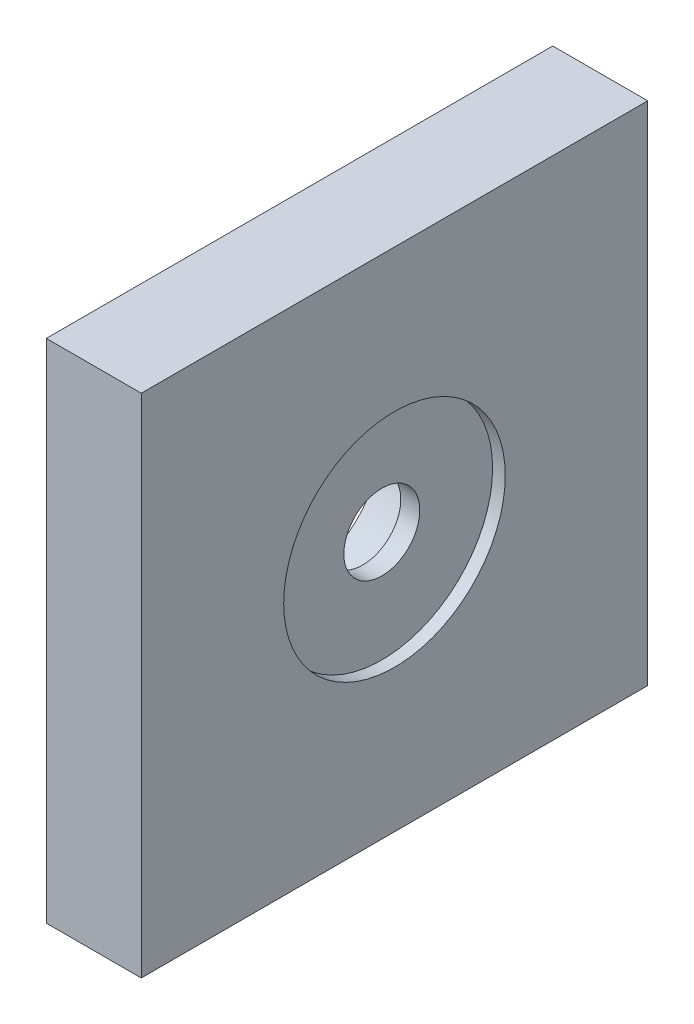
ISO-10303-21;
HEADER;
FILE_DESCRIPTION(('STEP AP214'),'2;1');
FILE_NAME('part.step','',(''),(''),'','','');
FILE_SCHEMA(('AUTOMOTIVE_DESIGN { 1 0 10303 214 1 1 1 1 }'));
ENDSEC;
DATA;
#1=APPLICATION_CONTEXT('core data for automotive mechanical design processes');
#2=APPLICATION_PROTOCOL_DEFINITION('international standard','automotive_design',2000,#1);
#3=PRODUCT_CONTEXT('',#1,'mechanical');
#4=PRODUCT('Part','Part','',(#3));
#5=PRODUCT_RELATED_PRODUCT_CATEGORY('part','',(#4));
#6=PRODUCT_DEFINITION_FORMATION('','',#4);
#7=PRODUCT_DEFINITION_CONTEXT('part definition',#1,'design');
#8=PRODUCT_DEFINITION('design','',#6,#7);
#9=PRODUCT_DEFINITION_SHAPE('','',#8);
#10=(LENGTH_UNIT() NAMED_UNIT(*) SI_UNIT(.MILLI.,.METRE.));
#11=(NAMED_UNIT(*) PLANE_ANGLE_UNIT() SI_UNIT($,.RADIAN.));
#12=(NAMED_UNIT(*) SI_UNIT($,.STERADIAN.) SOLID_ANGLE_UNIT());
#13=UNCERTAINTY_MEASURE_WITH_UNIT(LENGTH_MEASURE(1.E-05),#10,'distance_accuracy_value','');
#14=(GEOMETRIC_REPRESENTATION_CONTEXT(3) GLOBAL_UNCERTAINTY_ASSIGNED_CONTEXT((#13)) GLOBAL_UNIT_ASSIGNED_CONTEXT((#10,
#11,#12)) REPRESENTATION_CONTEXT('',''));
#15=CARTESIAN_POINT('',(0.,0.,0.));
#16=DIRECTION('',(0.,0.,1.));
#17=DIRECTION('',(1.,0.,0.));
#18=AXIS2_PLACEMENT_3D('',#15,#16,#17);
#19=CARTESIAN_POINT('',(15.,80.,0.));
#20=DIRECTION('',(0.,0.,-1.));
#21=DIRECTION('',(-1.,0.,0.));
#22=AXIS2_PLACEMENT_3D('',#19,#20,#21);
#23=PLANE('',#22);
#24=DIRECTION('',(0.,-1.,0.));
#25=VECTOR('',#24,1.);
#26=CARTESIAN_POINT('',(0.,80.,0.));
#27=LINE('',#26,#25);
#28=CARTESIAN_POINT('',(0.,80.,0.));
#29=VERTEX_POINT('',#28);
#30=CARTESIAN_POINT('',(0.,0.,0.));
#31=VERTEX_POINT('',#30);
#32=EDGE_CURVE('E116',#29,#31,#27,.T.);
#33=ORIENTED_EDGE('',*,*,#32,.F.);
#34=DIRECTION('',(-1.,0.,0.));
#35=VECTOR('',#34,1.);
#36=CARTESIAN_POINT('',(15.,80.,0.));
#37=LINE('',#36,#35);
#38=CARTESIAN_POINT('',(15.,80.,0.));
#39=VERTEX_POINT('',#38);
#40=EDGE_CURVE('E11',#39,#29,#37,.T.);
#41=ORIENTED_EDGE('',*,*,#40,.F.);
#42=DIRECTION('',(0.,-1.,0.));
#43=VECTOR('',#42,1.);
#44=CARTESIAN_POINT('',(15.,80.,0.));
#45=LINE('',#44,#43);
#46=CARTESIAN_POINT('',(15.,0.,0.));
#47=VERTEX_POINT('',#46);
#48=EDGE_CURVE('E107',#39,#47,#45,.T.);
#49=ORIENTED_EDGE('',*,*,#48,.T.);
#50=DIRECTION('',(-1.,0.,0.));
#51=VECTOR('',#50,1.);
#52=CARTESIAN_POINT('',(15.,0.,0.));
#53=LINE('',#52,#51);
#54=EDGE_CURVE('E48',#47,#31,#53,.T.);
#55=ORIENTED_EDGE('',*,*,#54,.T.);
#56=EDGE_LOOP('',(#33,#41,#49,#55));
#57=FACE_BOUND('',#56,.T.);
#58=ADVANCED_FACE('F45',(#57),#23,.T.);
#59=CARTESIAN_POINT('',(15.,80.,80.));
#60=DIRECTION('',(0.,1.,0.));
#61=DIRECTION('',(0.,0.,1.));
#62=AXIS2_PLACEMENT_3D('',#59,#60,#61);
#63=PLANE('',#62);
#64=DIRECTION('',(0.,0.,-1.));
#65=VECTOR('',#64,1.);
#66=CARTESIAN_POINT('',(0.,80.,80.));
#67=LINE('',#66,#65);
#68=CARTESIAN_POINT('',(0.,80.,80.));
#69=VERTEX_POINT('',#68);
#70=EDGE_CURVE('E110',#69,#29,#67,.T.);
#71=ORIENTED_EDGE('',*,*,#70,.F.);
#72=DIRECTION('',(-1.,0.,0.));
#73=VECTOR('',#72,1.);
#74=CARTESIAN_POINT('',(15.,80.,80.));
#75=LINE('',#74,#73);
#76=CARTESIAN_POINT('',(15.,80.,80.));
#77=VERTEX_POINT('',#76);
#78=EDGE_CURVE('E55',#77,#69,#75,.T.);
#79=ORIENTED_EDGE('',*,*,#78,.F.);
#80=DIRECTION('',(0.,0.,-1.));
#81=VECTOR('',#80,1.);
#82=CARTESIAN_POINT('',(15.,80.,80.));
#83=LINE('',#82,#81);
#84=EDGE_CURVE('E102',#77,#39,#83,.T.);
#85=ORIENTED_EDGE('',*,*,#84,.T.);
#86=ORIENTED_EDGE('',*,*,#40,.T.);
#87=EDGE_LOOP('',(#71,#79,#85,#86));
#88=FACE_BOUND('',#87,.T.);
#89=ADVANCED_FACE('F133',(#88),#63,.T.);
#90=CARTESIAN_POINT('',(15.,0.,80.));
#91=DIRECTION('',(0.,0.,1.));
#92=DIRECTION('',(0.,-1.,0.));
#93=AXIS2_PLACEMENT_3D('',#90,#91,#92);
#94=PLANE('',#93);
#95=DIRECTION('',(0.,1.,0.));
#96=VECTOR('',#95,1.);
#97=CARTESIAN_POINT('',(0.,0.,80.));
#98=LINE('',#97,#96);
#99=CARTESIAN_POINT('',(0.,0.,80.));
#100=VERTEX_POINT('',#99);
#101=EDGE_CURVE('E96',#100,#69,#98,.T.);
#102=ORIENTED_EDGE('',*,*,#101,.F.);
#103=DIRECTION('',(-1.,0.,0.));
#104=VECTOR('',#103,1.);
#105=CARTESIAN_POINT('',(15.,0.,80.));
#106=LINE('',#105,#104);
#107=CARTESIAN_POINT('',(15.,0.,80.));
#108=VERTEX_POINT('',#107);
#109=EDGE_CURVE('E91',#108,#100,#106,.T.);
#110=ORIENTED_EDGE('',*,*,#109,.F.);
#111=DIRECTION('',(0.,1.,0.));
#112=VECTOR('',#111,1.);
#113=CARTESIAN_POINT('',(15.,0.,80.));
#114=LINE('',#113,#112);
#115=EDGE_CURVE('E94',#108,#77,#114,.T.);
#116=ORIENTED_EDGE('',*,*,#115,.T.);
#117=ORIENTED_EDGE('',*,*,#78,.T.);
#118=EDGE_LOOP('',(#102,#110,#116,#117));
#119=FACE_BOUND('',#118,.T.);
#120=ADVANCED_FACE('F93',(#119),#94,.T.);
#121=CARTESIAN_POINT('',(15.,0.,0.));
#122=DIRECTION('',(0.,-1.,0.));
#123=DIRECTION('',(0.,0.,-1.));
#124=AXIS2_PLACEMENT_3D('',#121,#122,#123);
#125=PLANE('',#124);
#126=DIRECTION('',(0.,0.,1.));
#127=VECTOR('',#126,1.);
#128=CARTESIAN_POINT('',(0.,0.,0.));
#129=LINE('',#128,#127);
#130=EDGE_CURVE('E120',#31,#100,#129,.T.);
#131=ORIENTED_EDGE('',*,*,#130,.F.);
#132=ORIENTED_EDGE('',*,*,#54,.F.);
#133=DIRECTION('',(0.,0.,1.));
#134=VECTOR('',#133,1.);
#135=CARTESIAN_POINT('',(15.,0.,0.));
#136=LINE('',#135,#134);
#137=EDGE_CURVE('E101',#47,#108,#136,.T.);
#138=ORIENTED_EDGE('',*,*,#137,.T.);
#139=ORIENTED_EDGE('',*,*,#109,.T.);
#140=EDGE_LOOP('',(#131,#132,#138,#139));
#141=FACE_BOUND('',#140,.T.);
#142=ADVANCED_FACE('F105',(#141),#125,.T.);
#143=CARTESIAN_POINT('',(15.,0.,0.));
#144=DIRECTION('',(-1.,0.,0.));
#145=DIRECTION('',(0.,0.,1.));
#146=AXIS2_PLACEMENT_3D('',#143,#144,#145);
#147=PLANE('',#146);
#148=CARTESIAN_POINT('',(15.,40.,40.));
#149=DIRECTION('',(-1.,0.,0.));
#150=DIRECTION('',(0.,0.,1.));
#151=AXIS2_PLACEMENT_3D('',#148,#149,#150);
#152=CIRCLE('',#151,17.5);
#153=CARTESIAN_POINT('',(15.,40.,57.5));
#154=VERTEX_POINT('',#153);
#155=EDGE_CURVE('E121',#154,#154,#152,.T.);
#156=ORIENTED_EDGE('',*,*,#155,.T.);
#157=EDGE_LOOP('',(#156));
#158=FACE_BOUND('',#157,.T.);
#159=ORIENTED_EDGE('',*,*,#48,.F.);
#160=ORIENTED_EDGE('',*,*,#84,.F.);
#161=ORIENTED_EDGE('',*,*,#115,.F.);
#162=ORIENTED_EDGE('',*,*,#137,.F.);
#163=EDGE_LOOP('',(#159,#160,#161,#162));
#164=FACE_BOUND('',#163,.T.);
#165=ADVANCED_FACE('F100',(#158,#164),#147,.F.);
#166=CARTESIAN_POINT('',(0.,0.,0.));
#167=DIRECTION('',(-1.,0.,0.));
#168=DIRECTION('',(0.,0.,1.));
#169=AXIS2_PLACEMENT_3D('',#166,#167,#168);
#170=PLANE('',#169);
#171=CARTESIAN_POINT('',(0.,40.,40.));
#172=DIRECTION('',(-1.,0.,0.));
#173=DIRECTION('',(0.,0.,1.));
#174=AXIS2_PLACEMENT_3D('',#171,#172,#173);
#175=CIRCLE('',#174,13.);
#176=CARTESIAN_POINT('',(0.,40.,53.));
#177=VERTEX_POINT('',#176);
#178=EDGE_CURVE('E195',#177,#177,#175,.T.);
#179=ORIENTED_EDGE('',*,*,#178,.F.);
#180=EDGE_LOOP('',(#179));
#181=FACE_BOUND('',#180,.T.);
#182=ORIENTED_EDGE('',*,*,#32,.T.);
#183=ORIENTED_EDGE('',*,*,#130,.T.);
#184=ORIENTED_EDGE('',*,*,#101,.T.);
#185=ORIENTED_EDGE('',*,*,#70,.T.);
#186=EDGE_LOOP('',(#182,#183,#184,#185));
#187=FACE_BOUND('',#186,.T.);
#188=ADVANCED_FACE('F132',(#181,#187),#170,.T.);
#189=CARTESIAN_POINT('',(15.,40.,40.));
#190=DIRECTION('',(-1.,0.,0.));
#191=DIRECTION('',(0.,0.,1.));
#192=AXIS2_PLACEMENT_3D('',#189,#190,#191);
#193=CYLINDRICAL_SURFACE('',#192,17.5);
#194=ORIENTED_EDGE('',*,*,#155,.F.);
#195=EDGE_LOOP('',(#194));
#196=FACE_BOUND('',#195,.T.);
#197=CARTESIAN_POINT('',(13.,40.,40.));
#198=DIRECTION('',(-1.,0.,0.));
#199=DIRECTION('',(0.,0.,1.));
#200=AXIS2_PLACEMENT_3D('',#197,#198,#199);
#201=CIRCLE('',#200,17.5);
#202=CARTESIAN_POINT('',(13.,40.,57.5));
#203=VERTEX_POINT('',#202);
#204=EDGE_CURVE('E178',#203,#203,#201,.T.);
#205=ORIENTED_EDGE('',*,*,#204,.T.);
#206=EDGE_LOOP('',(#205));
#207=FACE_BOUND('',#206,.T.);
#208=ADVANCED_FACE('F151',(#196,#207),#193,.F.);
#209=CARTESIAN_POINT('',(15.,40.,40.));
#210=DIRECTION('',(-1.,0.,0.));
#211=DIRECTION('',(0.,0.,1.));
#212=AXIS2_PLACEMENT_3D('',#209,#210,#211);
#213=CYLINDRICAL_SURFACE('',#212,13.);
#214=CARTESIAN_POINT('',(10.,40.,40.));
#215=DIRECTION('',(-1.,0.,0.));
#216=DIRECTION('',(0.,0.,1.));
#217=AXIS2_PLACEMENT_3D('',#214,#215,#216);
#218=CIRCLE('',#217,13.);
#219=CARTESIAN_POINT('',(10.,40.,53.));
#220=VERTEX_POINT('',#219);
#221=EDGE_CURVE('E188',#220,#220,#218,.T.);
#222=ORIENTED_EDGE('',*,*,#221,.F.);
#223=EDGE_LOOP('',(#222));
#224=FACE_BOUND('',#223,.T.);
#225=ORIENTED_EDGE('',*,*,#178,.T.);
#226=EDGE_LOOP('',(#225));
#227=FACE_BOUND('',#226,.T.);
#228=ADVANCED_FACE('F157',(#224,#227),#213,.F.);
#229=CARTESIAN_POINT('',(10.,53.,40.));
#230=DIRECTION('',(1.,0.,0.));
#231=DIRECTION('',(0.,0.,-1.));
#232=AXIS2_PLACEMENT_3D('',#229,#230,#231);
#233=PLANE('',#232);
#234=CARTESIAN_POINT('',(10.,40.,40.));
#235=DIRECTION('',(-1.,0.,0.));
#236=DIRECTION('',(0.,0.,1.));
#237=AXIS2_PLACEMENT_3D('',#234,#235,#236);
#238=CIRCLE('',#237,6.);
#239=CARTESIAN_POINT('',(10.,40.,46.));
#240=VERTEX_POINT('',#239);
#241=EDGE_CURVE('E183',#240,#240,#238,.T.);
#242=ORIENTED_EDGE('',*,*,#241,.F.);
#243=EDGE_LOOP('',(#242));
#244=FACE_BOUND('',#243,.T.);
#245=ORIENTED_EDGE('',*,*,#221,.T.);
#246=EDGE_LOOP('',(#245));
#247=FACE_BOUND('',#246,.T.);
#248=ADVANCED_FACE('F161',(#244,#247),#233,.F.);
#249=CARTESIAN_POINT('',(15.,40.,40.));
#250=DIRECTION('',(-1.,0.,0.));
#251=DIRECTION('',(0.,0.,1.));
#252=AXIS2_PLACEMENT_3D('',#249,#250,#251);
#253=CYLINDRICAL_SURFACE('',#252,6.);
#254=CARTESIAN_POINT('',(13.,40.,40.));
#255=DIRECTION('',(-1.,0.,0.));
#256=DIRECTION('',(0.,0.,1.));
#257=AXIS2_PLACEMENT_3D('',#254,#255,#256);
#258=CIRCLE('',#257,6.);
#259=CARTESIAN_POINT('',(13.,40.,46.));
#260=VERTEX_POINT('',#259);
#261=EDGE_CURVE('E181',#260,#260,#258,.T.);
#262=ORIENTED_EDGE('',*,*,#261,.F.);
#263=EDGE_LOOP('',(#262));
#264=FACE_BOUND('',#263,.T.);
#265=ORIENTED_EDGE('',*,*,#241,.T.);
#266=EDGE_LOOP('',(#265));
#267=FACE_BOUND('',#266,.T.);
#268=ADVANCED_FACE('F165',(#264,#267),#253,.F.);
#269=CARTESIAN_POINT('',(13.,46.,40.));
#270=DIRECTION('',(-1.,0.,0.));
#271=DIRECTION('',(0.,0.,1.));
#272=AXIS2_PLACEMENT_3D('',#269,#270,#271);
#273=PLANE('',#272);
#274=ORIENTED_EDGE('',*,*,#204,.F.);
#275=EDGE_LOOP('',(#274));
#276=FACE_BOUND('',#275,.T.);
#277=ORIENTED_EDGE('',*,*,#261,.T.);
#278=EDGE_LOOP('',(#277));
#279=FACE_BOUND('',#278,.T.);
#280=ADVANCED_FACE('F169',(#276,#279),#273,.F.);
#281=CLOSED_SHELL('',(#58,#89,#120,#142,#165,#188,#208,#228,#248,#268,#280));
#282=MANIFOLD_SOLID_BREP('B2',#281);
#283=ADVANCED_BREP_SHAPE_REPRESENTATION('',(#18,#282),#14);
#284=SHAPE_DEFINITION_REPRESENTATION(#9,#283);
ENDSEC;
END-ISO-10303-21;
